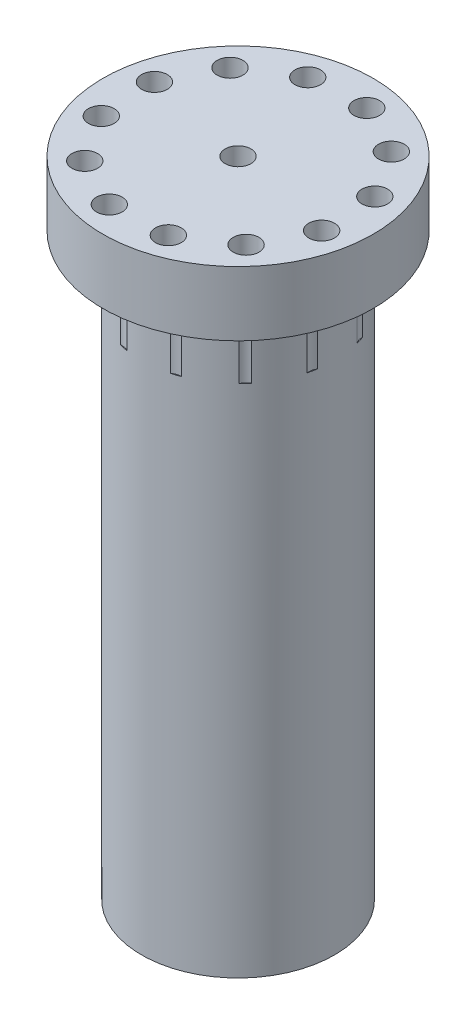
ISO-10303-21;
HEADER;
FILE_DESCRIPTION(('STEP AP214'),'2;1');
FILE_NAME('part.step','',(''),(''),'','','');
FILE_SCHEMA(('AUTOMOTIVE_DESIGN { 1 0 10303 214 1 1 1 1 }'));
ENDSEC;
DATA;
#1=APPLICATION_CONTEXT('core data for automotive mechanical design processes');
#2=APPLICATION_PROTOCOL_DEFINITION('international standard','automotive_design',2000,#1);
#3=PRODUCT_CONTEXT('',#1,'mechanical');
#4=PRODUCT('Part','Part','',(#3));
#5=PRODUCT_RELATED_PRODUCT_CATEGORY('part','',(#4));
#6=PRODUCT_DEFINITION_FORMATION('','',#4);
#7=PRODUCT_DEFINITION_CONTEXT('part definition',#1,'design');
#8=PRODUCT_DEFINITION('design','',#6,#7);
#9=PRODUCT_DEFINITION_SHAPE('','',#8);
#10=(LENGTH_UNIT() NAMED_UNIT(*) SI_UNIT(.MILLI.,.METRE.));
#11=(NAMED_UNIT(*) PLANE_ANGLE_UNIT() SI_UNIT($,.RADIAN.));
#12=(NAMED_UNIT(*) SI_UNIT($,.STERADIAN.) SOLID_ANGLE_UNIT());
#13=UNCERTAINTY_MEASURE_WITH_UNIT(LENGTH_MEASURE(1.E-05),#10,'distance_accuracy_value','');
#14=(GEOMETRIC_REPRESENTATION_CONTEXT(3) GLOBAL_UNCERTAINTY_ASSIGNED_CONTEXT((#13)) GLOBAL_UNIT_ASSIGNED_CONTEXT((#10,
#11,#12)) REPRESENTATION_CONTEXT('',''));
#15=CARTESIAN_POINT('',(0.,0.,0.));
#16=DIRECTION('',(0.,0.,1.));
#17=DIRECTION('',(1.,0.,0.));
#18=AXIS2_PLACEMENT_3D('',#15,#16,#17);
#19=CARTESIAN_POINT('',(0.,3.,0.));
#20=DIRECTION('',(0.,1.,0.));
#21=DIRECTION('',(0.,0.,1.));
#22=AXIS2_PLACEMENT_3D('',#19,#20,#21);
#23=PLANE('',#22);
#24=CARTESIAN_POINT('',(0.,3.,0.));
#25=DIRECTION('',(0.,1.,0.));
#26=DIRECTION('',(0.,0.,1.));
#27=AXIS2_PLACEMENT_3D('',#24,#25,#26);
#28=CIRCLE('',#27,3.);
#29=CARTESIAN_POINT('',(0.,3.,3.));
#30=VERTEX_POINT('',#29);
#31=EDGE_CURVE('E49',#30,#30,#28,.T.);
#32=ORIENTED_EDGE('',*,*,#31,.F.);
#33=EDGE_LOOP('',(#32));
#34=FACE_BOUND('',#33,.T.);
#35=CARTESIAN_POINT('',(0.,3.,0.));
#36=DIRECTION('',(0.,-1.,0.));
#37=DIRECTION('',(0.,0.,-1.));
#38=AXIS2_PLACEMENT_3D('',#35,#36,#37);
#39=CIRCLE('',#38,4.1);
#40=CARTESIAN_POINT('',(0.,3.,-4.1));
#41=VERTEX_POINT('',#40);
#42=EDGE_CURVE('E216',#41,#41,#39,.T.);
#43=ORIENTED_EDGE('',*,*,#42,.F.);
#44=EDGE_LOOP('',(#43));
#45=FACE_BOUND('',#44,.T.);
#46=ADVANCED_FACE('F45',(#34,#45),#23,.T.);
#47=CARTESIAN_POINT('',(0.,18.,0.));
#48=DIRECTION('',(0.,-1.,0.));
#49=DIRECTION('',(0.,0.,-1.));
#50=AXIS2_PLACEMENT_3D('',#47,#48,#49);
#51=CYLINDRICAL_SURFACE('',#50,4.1);
#52=ORIENTED_EDGE('',*,*,#42,.T.);
#53=EDGE_LOOP('',(#52));
#54=FACE_BOUND('',#53,.T.);
#55=CARTESIAN_POINT('',(0.,18.,0.));
#56=DIRECTION('',(0.,-1.,0.));
#57=DIRECTION('',(0.,0.,-1.));
#58=AXIS2_PLACEMENT_3D('',#55,#56,#57);
#59=CIRCLE('',#58,4.1);
#60=CARTESIAN_POINT('',(0.,18.,-4.1));
#61=VERTEX_POINT('',#60);
#62=EDGE_CURVE('E613',#61,#61,#59,.T.);
#63=ORIENTED_EDGE('',*,*,#62,.F.);
#64=EDGE_LOOP('',(#63));
#65=FACE_BOUND('',#64,.T.);
#66=ADVANCED_FACE('F622',(#54,#65),#51,.F.);
#67=CARTESIAN_POINT('',(4.1,18.,0.));
#68=DIRECTION('',(0.,-1.,0.));
#69=DIRECTION('',(0.,0.,-1.));
#70=AXIS2_PLACEMENT_3D('',#67,#68,#69);
#71=PLANE('',#70);
#72=CARTESIAN_POINT('',(0.,18.,0.));
#73=DIRECTION('',(0.,-1.,0.));
#74=DIRECTION('',(0.,0.,-1.));
#75=AXIS2_PLACEMENT_3D('',#72,#73,#74);
#76=CIRCLE('',#75,1.);
#77=CARTESIAN_POINT('',(0.,18.,-1.));
#78=VERTEX_POINT('',#77);
#79=EDGE_CURVE('E570',#78,#78,#76,.T.);
#80=ORIENTED_EDGE('',*,*,#79,.F.);
#81=EDGE_LOOP('',(#80));
#82=FACE_BOUND('',#81,.T.);
#83=ORIENTED_EDGE('',*,*,#62,.T.);
#84=EDGE_LOOP('',(#83));
#85=FACE_BOUND('',#84,.T.);
#86=ADVANCED_FACE('F630',(#82,#85),#71,.T.);
#87=CARTESIAN_POINT('',(0.,10.,0.));
#88=DIRECTION('',(0.,-1.,0.));
#89=DIRECTION('',(1.,0.,0.));
#90=AXIS2_PLACEMENT_3D('',#87,#88,#89);
#91=CYLINDRICAL_SURFACE('',#90,3.);
#92=ORIENTED_EDGE('',*,*,#31,.T.);
#93=EDGE_LOOP('',(#92));
#94=FACE_BOUND('',#93,.T.);
#95=CARTESIAN_POINT('',(0.,0.,0.));
#96=DIRECTION('',(0.,-1.,0.));
#97=DIRECTION('',(1.,0.,0.));
#98=AXIS2_PLACEMENT_3D('',#95,#96,#97);
#99=CIRCLE('',#98,3.);
#100=CARTESIAN_POINT('',(3.,0.,0.));
#101=VERTEX_POINT('',#100);
#102=EDGE_CURVE('E566',#101,#101,#99,.T.);
#103=ORIENTED_EDGE('',*,*,#102,.T.);
#104=EDGE_LOOP('',(#103));
#105=FACE_BOUND('',#104,.T.);
#106=ADVANCED_FACE('F635',(#94,#105),#91,.F.);
#107=CARTESIAN_POINT('',(7.5,0.,0.));
#108=DIRECTION('',(0.,-1.,0.));
#109=DIRECTION('',(0.,0.,-1.));
#110=AXIS2_PLACEMENT_3D('',#107,#108,#109);
#111=PLANE('',#110);
#112=ORIENTED_EDGE('',*,*,#102,.F.);
#113=EDGE_LOOP('',(#112));
#114=FACE_BOUND('',#113,.T.);
#115=CARTESIAN_POINT('',(0.,0.,0.));
#116=DIRECTION('',(0.,-1.,0.));
#117=DIRECTION('',(0.,0.,-1.));
#118=AXIS2_PLACEMENT_3D('',#115,#116,#117);
#119=CIRCLE('',#118,7.5);
#120=CARTESIAN_POINT('',(0.,0.,-7.5));
#121=VERTEX_POINT('',#120);
#122=EDGE_CURVE('E371',#121,#121,#119,.T.);
#123=ORIENTED_EDGE('',*,*,#122,.T.);
#124=EDGE_LOOP('',(#123));
#125=FACE_BOUND('',#124,.T.);
#126=ADVANCED_FACE('F47',(#114,#125),#111,.T.);
#127=CARTESIAN_POINT('',(7.5,50.,0.));
#128=DIRECTION('',(0.,1.,0.));
#129=DIRECTION('',(0.,0.,1.));
#130=AXIS2_PLACEMENT_3D('',#127,#128,#129);
#131=PLANE('',#130);
#132=CARTESIAN_POINT('',(0.,50.,0.));
#133=DIRECTION('',(0.,1.,0.));
#134=DIRECTION('',(0.,0.,1.));
#135=AXIS2_PLACEMENT_3D('',#132,#133,#134);
#136=CIRCLE('',#135,1.);
#137=CARTESIAN_POINT('',(0.,50.,1.));
#138=VERTEX_POINT('',#137);
#139=EDGE_CURVE('E574',#138,#138,#136,.T.);
#140=ORIENTED_EDGE('',*,*,#139,.F.);
#141=EDGE_LOOP('',(#140));
#142=FACE_BOUND('',#141,.T.);
#143=CARTESIAN_POINT('',(1.75395634255126,50.,-8.2500000000006));
#144=DIRECTION('',(0.,1.,0.));
#145=DIRECTION('',(-1.,0.,0.));
#146=AXIS2_PLACEMENT_3D('',#143,#144,#145);
#147=CIRCLE('',#146,1.);
#148=CARTESIAN_POINT('',(0.753956342551261,50.,-8.2500000000006));
#149=VERTEX_POINT('',#148);
#150=EDGE_CURVE('E539',#149,#149,#147,.T.);
#151=ORIENTED_EDGE('',*,*,#150,.F.);
#152=EDGE_LOOP('',(#151));
#153=FACE_BOUND('',#152,.T.);
#154=CARTESIAN_POINT('',(5.64397074977852,50.,-6.26773140994676));
#155=DIRECTION('',(0.,1.,0.));
#156=DIRECTION('',(-1.,0.,0.));
#157=AXIS2_PLACEMENT_3D('',#154,#155,#156);
#158=CIRCLE('',#157,1.);
#159=CARTESIAN_POINT('',(4.64397074977852,50.,-6.26773140994676));
#160=VERTEX_POINT('',#159);
#161=EDGE_CURVE('E489',#160,#160,#158,.T.);
#162=ORIENTED_EDGE('',*,*,#161,.F.);
#163=EDGE_LOOP('',(#162));
#164=FACE_BOUND('',#163,.T.);
#165=CARTESIAN_POINT('',(8.02168775249787,50.,-2.60602925022254));
#166=DIRECTION('',(0.,1.,0.));
#167=DIRECTION('',(-1.,0.,0.));
#168=AXIS2_PLACEMENT_3D('',#165,#166,#167);
#169=CIRCLE('',#168,1.);
#170=CARTESIAN_POINT('',(7.02168775249787,50.,-2.60602925022254));
#171=VERTEX_POINT('',#170);
#172=EDGE_CURVE('E490',#171,#171,#169,.T.);
#173=ORIENTED_EDGE('',*,*,#172,.F.);
#174=EDGE_LOOP('',(#173));
#175=FACE_BOUND('',#174,.T.);
#176=CARTESIAN_POINT('',(8.25000000000091,50.,1.75395634255066));
#177=DIRECTION('',(0.,1.,0.));
#178=DIRECTION('',(-1.,0.,0.));
#179=AXIS2_PLACEMENT_3D('',#176,#177,#178);
#180=CIRCLE('',#179,1.);
#181=CARTESIAN_POINT('',(7.25000000000091,50.,1.75395634255066));
#182=VERTEX_POINT('',#181);
#183=EDGE_CURVE('E503',#182,#182,#180,.T.);
#184=ORIENTED_EDGE('',*,*,#183,.F.);
#185=EDGE_LOOP('',(#184));
#186=FACE_BOUND('',#185,.T.);
#187=CARTESIAN_POINT('',(6.26773140994707,50.,5.64397074977792));
#188=DIRECTION('',(0.,1.,0.));
#189=DIRECTION('',(-1.,0.,0.));
#190=AXIS2_PLACEMENT_3D('',#187,#188,#189);
#191=CIRCLE('',#190,1.);
#192=CARTESIAN_POINT('',(5.26773140994707,50.,5.64397074977792));
#193=VERTEX_POINT('',#192);
#194=EDGE_CURVE('E510',#193,#193,#191,.T.);
#195=ORIENTED_EDGE('',*,*,#194,.F.);
#196=EDGE_LOOP('',(#195));
#197=FACE_BOUND('',#196,.T.);
#198=CARTESIAN_POINT('',(2.60602925022285,50.,8.02168775249727));
#199=DIRECTION('',(0.,1.,0.));
#200=DIRECTION('',(-1.,0.,0.));
#201=AXIS2_PLACEMENT_3D('',#198,#199,#200);
#202=CIRCLE('',#201,1.);
#203=CARTESIAN_POINT('',(1.60602925022285,50.,8.02168775249727));
#204=VERTEX_POINT('',#203);
#205=EDGE_CURVE('E517',#204,#204,#202,.T.);
#206=ORIENTED_EDGE('',*,*,#205,.F.);
#207=EDGE_LOOP('',(#206));
#208=FACE_BOUND('',#207,.T.);
#209=CARTESIAN_POINT('',(-1.75395634255035,50.,8.25000000000031));
#210=DIRECTION('',(0.,1.,0.));
#211=DIRECTION('',(-1.,0.,0.));
#212=AXIS2_PLACEMENT_3D('',#209,#210,#211);
#213=CIRCLE('',#212,1.);
#214=CARTESIAN_POINT('',(-2.75395634255035,50.,8.25000000000031));
#215=VERTEX_POINT('',#214);
#216=EDGE_CURVE('E524',#215,#215,#213,.T.);
#217=ORIENTED_EDGE('',*,*,#216,.F.);
#218=EDGE_LOOP('',(#217));
#219=FACE_BOUND('',#218,.T.);
#220=CARTESIAN_POINT('',(-5.64397074977761,50.,6.26773140994647));
#221=DIRECTION('',(0.,1.,0.));
#222=DIRECTION('',(-1.,0.,0.));
#223=AXIS2_PLACEMENT_3D('',#220,#221,#222);
#224=CIRCLE('',#223,1.);
#225=CARTESIAN_POINT('',(-6.64397074977761,50.,6.26773140994647));
#226=VERTEX_POINT('',#225);
#227=EDGE_CURVE('E531',#226,#226,#224,.T.);
#228=ORIENTED_EDGE('',*,*,#227,.F.);
#229=EDGE_LOOP('',(#228));
#230=FACE_BOUND('',#229,.T.);
#231=CARTESIAN_POINT('',(-8.02168775249696,50.,2.60602925022224));
#232=DIRECTION('',(0.,1.,0.));
#233=DIRECTION('',(-1.,0.,0.));
#234=AXIS2_PLACEMENT_3D('',#231,#232,#233);
#235=CIRCLE('',#234,1.);
#236=CARTESIAN_POINT('',(-9.02168775249696,50.,2.60602925022224));
#237=VERTEX_POINT('',#236);
#238=EDGE_CURVE('E560',#237,#237,#235,.T.);
#239=ORIENTED_EDGE('',*,*,#238,.F.);
#240=EDGE_LOOP('',(#239));
#241=FACE_BOUND('',#240,.T.);
#242=CARTESIAN_POINT('',(-8.25,50.,-1.75395634255095));
#243=DIRECTION('',(0.,1.,0.));
#244=DIRECTION('',(-1.,0.,0.));
#245=AXIS2_PLACEMENT_3D('',#242,#243,#244);
#246=CIRCLE('',#245,1.);
#247=CARTESIAN_POINT('',(-9.25,50.,-1.75395634255095));
#248=VERTEX_POINT('',#247);
#249=EDGE_CURVE('E553',#248,#248,#246,.T.);
#250=ORIENTED_EDGE('',*,*,#249,.F.);
#251=EDGE_LOOP('',(#250));
#252=FACE_BOUND('',#251,.T.);
#253=CARTESIAN_POINT('',(-6.26773140994616,50.,-5.64397074977821));
#254=DIRECTION('',(0.,1.,0.));
#255=DIRECTION('',(-1.,0.,0.));
#256=AXIS2_PLACEMENT_3D('',#253,#254,#255);
#257=CIRCLE('',#256,0.999999999999999);
#258=CARTESIAN_POINT('',(-7.26773140994616,50.,-5.64397074977821));
#259=VERTEX_POINT('',#258);
#260=EDGE_CURVE('E545',#259,#259,#257,.T.);
#261=ORIENTED_EDGE('',*,*,#260,.F.);
#262=EDGE_LOOP('',(#261));
#263=FACE_BOUND('',#262,.T.);
#264=CARTESIAN_POINT('',(-2.60602925022193,50.,-8.02168775249756));
#265=DIRECTION('',(0.,1.,0.));
#266=DIRECTION('',(-1.,0.,0.));
#267=AXIS2_PLACEMENT_3D('',#264,#265,#266);
#268=CIRCLE('',#267,1.);
#269=CARTESIAN_POINT('',(-3.60602925022193,50.,-8.02168775249756));
#270=VERTEX_POINT('',#269);
#271=EDGE_CURVE('E225',#270,#270,#268,.T.);
#272=ORIENTED_EDGE('',*,*,#271,.F.);
#273=EDGE_LOOP('',(#272));
#274=FACE_BOUND('',#273,.T.);
#275=CARTESIAN_POINT('',(0.,50.,0.));
#276=DIRECTION('',(0.,-1.,0.));
#277=DIRECTION('',(0.,0.,-1.));
#278=AXIS2_PLACEMENT_3D('',#275,#276,#277);
#279=CIRCLE('',#278,10.5);
#280=CARTESIAN_POINT('',(0.,50.,-10.5));
#281=VERTEX_POINT('',#280);
#282=EDGE_CURVE('E389',#281,#281,#279,.T.);
#283=ORIENTED_EDGE('',*,*,#282,.F.);
#284=EDGE_LOOP('',(#283));
#285=FACE_BOUND('',#284,.T.);
#286=ADVANCED_FACE('F581',(#142,#153,#164,#175,#186,#197,#208,#219,#230,#241,#252,#263,#274,
#285),#131,.T.);
#287=CARTESIAN_POINT('',(0.,18.,0.));
#288=DIRECTION('',(0.,-1.,0.));
#289=DIRECTION('',(0.,0.,-1.));
#290=AXIS2_PLACEMENT_3D('',#287,#288,#289);
#291=CYLINDRICAL_SURFACE('',#290,10.5);
#292=ORIENTED_EDGE('',*,*,#282,.T.);
#293=EDGE_LOOP('',(#292));
#294=FACE_BOUND('',#293,.T.);
#295=CARTESIAN_POINT('',(0.,45.,0.));
#296=DIRECTION('',(0.,-1.,0.));
#297=DIRECTION('',(0.,0.,-1.));
#298=AXIS2_PLACEMENT_3D('',#295,#296,#297);
#299=CIRCLE('',#298,10.5);
#300=CARTESIAN_POINT('',(0.,45.,-10.5));
#301=VERTEX_POINT('',#300);
#302=EDGE_CURVE('E383',#301,#301,#299,.T.);
#303=ORIENTED_EDGE('',*,*,#302,.F.);
#304=EDGE_LOOP('',(#303));
#305=FACE_BOUND('',#304,.T.);
#306=ADVANCED_FACE('F584',(#294,#305),#291,.T.);
#307=CARTESIAN_POINT('',(10.5,45.,0.));
#308=DIRECTION('',(0.,-1.,0.));
#309=DIRECTION('',(0.,0.,-1.));
#310=AXIS2_PLACEMENT_3D('',#307,#308,#309);
#311=PLANE('',#310);
#312=CARTESIAN_POINT('',(1.75395634255126,45.,-8.2500000000006));
#313=DIRECTION('',(0.,-1.,0.));
#314=DIRECTION('',(0.,0.,-1.));
#315=AXIS2_PLACEMENT_3D('',#312,#313,#314);
#316=CIRCLE('',#315,1.);
#317=CARTESIAN_POINT('',(1.22956005914832,45.,-7.3985256680603));
#318=VERTEX_POINT('',#317);
#319=CARTESIAN_POINT('',(1.88660653025674,45.,-7.25883708316922));
#320=VERTEX_POINT('',#319);
#321=EDGE_CURVE('E359',#318,#320,#316,.T.);
#322=ORIENTED_EDGE('',*,*,#321,.F.);
#323=CARTESIAN_POINT('',(0.,45.,0.));
#324=DIRECTION('',(0.,-1.,0.));
#325=DIRECTION('',(0.,0.,-1.));
#326=AXIS2_PLACEMENT_3D('',#323,#324,#325);
#327=CIRCLE('',#326,7.49999999999999);
#328=CARTESIAN_POINT('',(-1.99556935943602,45.,-7.22964058108562));
#329=VERTEX_POINT('',#328);
#330=EDGE_CURVE('E366',#329,#318,#327,.T.);
#331=ORIENTED_EDGE('',*,*,#330,.F.);
#332=CARTESIAN_POINT('',(-2.60602925022193,45.,-8.02168775249756));
#333=DIRECTION('',(0.,-1.,0.));
#334=DIRECTION('',(0.,0.,-1.));
#335=AXIS2_PLACEMENT_3D('',#332,#333,#334);
#336=CIRCLE('',#335,1.);
#337=CARTESIAN_POINT('',(-2.63443258732952,45.,-7.02209120866543));
#338=VERTEX_POINT('',#337);
#339=EDGE_CURVE('E224',#338,#329,#336,.T.);
#340=ORIENTED_EDGE('',*,*,#339,.F.);
#341=CARTESIAN_POINT('',(-5.34303405082789,45.,-5.26326772373339));
#342=VERTEX_POINT('',#341);
#343=EDGE_CURVE('E233',#342,#338,#327,.T.);
#344=ORIENTED_EDGE('',*,*,#343,.F.);
#345=CARTESIAN_POINT('',(-6.26773140994616,45.,-5.64397074977821));
#346=DIRECTION('',(0.,-1.,0.));
#347=DIRECTION('',(0.,0.,-1.));
#348=AXIS2_PLACEMENT_3D('',#345,#346,#347);
#349=CIRCLE('',#348,0.999999999999999);
#350=CARTESIAN_POINT('',(-5.79253114951807,45.,-4.76409308073036));
#351=VERTEX_POINT('',#350);
#352=EDGE_CURVE('E444',#351,#342,#349,.T.);
#353=ORIENTED_EDGE('',*,*,#352,.F.);
#354=CARTESIAN_POINT('',(-7.25883708316885,45.,-1.88660653025816));
#355=VERTEX_POINT('',#354);
#356=EDGE_CURVE('E378',#355,#351,#327,.T.);
#357=ORIENTED_EDGE('',*,*,#356,.F.);
#358=CARTESIAN_POINT('',(-8.25,45.,-1.75395634255095));
#359=DIRECTION('',(0.,-1.,0.));
#360=DIRECTION('',(0.,0.,-1.));
#361=AXIS2_PLACEMENT_3D('',#358,#359,#360);
#362=CIRCLE('',#361,1.);
#363=CARTESIAN_POINT('',(-7.3985256680606,45.,-1.22956005914653));
#364=VERTEX_POINT('',#363);
#365=EDGE_CURVE('E443',#364,#355,#362,.T.);
#366=ORIENTED_EDGE('',*,*,#365,.F.);
#367=CARTESIAN_POINT('',(-7.22964058108582,45.,1.9955693594353));
#368=VERTEX_POINT('',#367);
#369=EDGE_CURVE('E427',#368,#364,#327,.T.);
#370=ORIENTED_EDGE('',*,*,#369,.F.);
#371=CARTESIAN_POINT('',(-8.02168775249696,45.,2.60602925022224));
#372=DIRECTION('',(0.,-1.,0.));
#373=DIRECTION('',(0.,0.,-1.));
#374=AXIS2_PLACEMENT_3D('',#371,#372,#373);
#375=CIRCLE('',#374,1.);
#376=CARTESIAN_POINT('',(-7.02209120866485,45.,2.63443258733105));
#377=VERTEX_POINT('',#376);
#378=EDGE_CURVE('E450',#377,#368,#375,.T.);
#379=ORIENTED_EDGE('',*,*,#378,.F.);
#380=CARTESIAN_POINT('',(-5.2632677237333,45.,5.34303405082797));
#381=VERTEX_POINT('',#380);
#382=EDGE_CURVE('E421',#381,#377,#327,.T.);
#383=ORIENTED_EDGE('',*,*,#382,.F.);
#384=CARTESIAN_POINT('',(-5.64397074977761,45.,6.26773140994647));
#385=DIRECTION('',(0.,-1.,0.));
#386=DIRECTION('',(0.,0.,-1.));
#387=AXIS2_PLACEMENT_3D('',#384,#385,#386);
#388=CIRCLE('',#387,1.);
#389=CARTESIAN_POINT('',(-4.76409308072958,45.,5.7925311495187));
#390=VERTEX_POINT('',#389);
#391=EDGE_CURVE('E457',#390,#381,#388,.T.);
#392=ORIENTED_EDGE('',*,*,#391,.F.);
#393=CARTESIAN_POINT('',(-1.88660653025718,45.,7.2588370831691));
#394=VERTEX_POINT('',#393);
#395=EDGE_CURVE('E415',#394,#390,#327,.T.);
#396=ORIENTED_EDGE('',*,*,#395,.F.);
#397=CARTESIAN_POINT('',(-1.75395634255035,45.,8.25000000000031));
#398=DIRECTION('',(0.,-1.,0.));
#399=DIRECTION('',(0.,0.,-1.));
#400=AXIS2_PLACEMENT_3D('',#397,#398,#399);
#401=CIRCLE('',#400,1.);
#402=CARTESIAN_POINT('',(-1.2295600591464,45.,7.39852566806062));
#403=VERTEX_POINT('',#402);
#404=EDGE_CURVE('E460',#403,#394,#401,.T.);
#405=ORIENTED_EDGE('',*,*,#404,.F.);
#406=CARTESIAN_POINT('',(1.99556935943686,45.,7.22964058108539));
#407=VERTEX_POINT('',#406);
#408=EDGE_CURVE('E409',#407,#403,#327,.T.);
#409=ORIENTED_EDGE('',*,*,#408,.F.);
#410=CARTESIAN_POINT('',(2.60602925022285,45.,8.02168775249727));
#411=DIRECTION('',(0.,-1.,0.));
#412=DIRECTION('',(0.,0.,-1.));
#413=AXIS2_PLACEMENT_3D('',#410,#411,#412);
#414=CIRCLE('',#413,1.);
#415=CARTESIAN_POINT('',(2.63443258733031,45.,7.02209120866513));
#416=VERTEX_POINT('',#415);
#417=EDGE_CURVE('E463',#416,#407,#414,.T.);
#418=ORIENTED_EDGE('',*,*,#417,.F.);
#419=CARTESIAN_POINT('',(5.34303405082923,45.,5.26326772373203));
#420=VERTEX_POINT('',#419);
#421=EDGE_CURVE('E403',#420,#416,#327,.T.);
#422=ORIENTED_EDGE('',*,*,#421,.F.);
#423=CARTESIAN_POINT('',(6.26773140994707,45.,5.64397074977792));
#424=DIRECTION('',(0.,-1.,0.));
#425=DIRECTION('',(0.,0.,-1.));
#426=AXIS2_PLACEMENT_3D('',#423,#424,#425);
#427=CIRCLE('',#426,1.);
#428=CARTESIAN_POINT('',(5.79253114951777,45.,4.76409308073072));
#429=VERTEX_POINT('',#428);
#430=EDGE_CURVE('E466',#429,#420,#427,.T.);
#431=ORIENTED_EDGE('',*,*,#430,.F.);
#432=CARTESIAN_POINT('',(7.25883708316947,45.,1.88660653025576));
#433=VERTEX_POINT('',#432);
#434=EDGE_CURVE('E397',#433,#429,#327,.T.);
#435=ORIENTED_EDGE('',*,*,#434,.F.);
#436=CARTESIAN_POINT('',(8.25000000000091,45.,1.75395634255066));
#437=DIRECTION('',(0.,-1.,0.));
#438=DIRECTION('',(0.,0.,-1.));
#439=AXIS2_PLACEMENT_3D('',#436,#437,#438);
#440=CIRCLE('',#439,1.);
#441=CARTESIAN_POINT('',(7.39852566806033,45.,1.22956005914818));
#442=VERTEX_POINT('',#441);
#443=EDGE_CURVE('E469',#442,#433,#440,.T.);
#444=ORIENTED_EDGE('',*,*,#443,.F.);
#445=CARTESIAN_POINT('',(7.22964058108519,45.,-1.99556935943757));
#446=VERTEX_POINT('',#445);
#447=EDGE_CURVE('E391',#446,#442,#327,.T.);
#448=ORIENTED_EDGE('',*,*,#447,.F.);
#449=CARTESIAN_POINT('',(8.02168775249787,45.,-2.60602925022254));
#450=DIRECTION('',(0.,-1.,0.));
#451=DIRECTION('',(0.,0.,-1.));
#452=AXIS2_PLACEMENT_3D('',#449,#450,#451);
#453=CIRCLE('',#452,1.);
#454=CARTESIAN_POINT('',(7.0220912086657,45.,-2.63443258732879));
#455=VERTEX_POINT('',#454);
#456=EDGE_CURVE('E472',#455,#446,#453,.T.);
#457=ORIENTED_EDGE('',*,*,#456,.F.);
#458=CARTESIAN_POINT('',(5.26326772373213,45.,-5.34303405082913));
#459=VERTEX_POINT('',#458);
#460=EDGE_CURVE('E384',#459,#455,#327,.T.);
#461=ORIENTED_EDGE('',*,*,#460,.F.);
#462=CARTESIAN_POINT('',(5.64397074977852,45.,-6.26773140994676));
#463=DIRECTION('',(0.,-1.,0.));
#464=DIRECTION('',(0.,0.,-1.));
#465=AXIS2_PLACEMENT_3D('',#462,#463,#464);
#466=CIRCLE('',#465,1.);
#467=CARTESIAN_POINT('',(4.76409308073151,45.,-5.79253114951712));
#468=VERTEX_POINT('',#467);
#469=EDGE_CURVE('E372',#468,#459,#466,.T.);
#470=ORIENTED_EDGE('',*,*,#469,.F.);
#471=EDGE_CURVE('E369',#320,#468,#327,.T.);
#472=ORIENTED_EDGE('',*,*,#471,.F.);
#473=EDGE_LOOP('',(#322,#331,#340,#344,#353,#357,#366,#370,#379,#383,#392,#396,#405,#409,#418,
#422,#431,#435,#444,#448,#457,#461,#470,#472));
#474=FACE_BOUND('',#473,.T.);
#475=ORIENTED_EDGE('',*,*,#302,.T.);
#476=EDGE_LOOP('',(#475));
#477=FACE_BOUND('',#476,.T.);
#478=ADVANCED_FACE('F364',(#474,#477),#311,.T.);
#479=CARTESIAN_POINT('',(0.,18.,0.));
#480=DIRECTION('',(0.,-1.,0.));
#481=DIRECTION('',(0.,0.,-1.));
#482=AXIS2_PLACEMENT_3D('',#479,#480,#481);
#483=CYLINDRICAL_SURFACE('',#482,7.5);
#484=DIRECTION('',(0.,1.,0.));
#485=VECTOR('',#484,1.);
#486=CARTESIAN_POINT('',(1.88660653025674,45.,-7.25883708316922));
#487=LINE('',#486,#485);
#488=CARTESIAN_POINT('',(1.88660653025675,40.,-7.25883708316922));
#489=VERTEX_POINT('',#488);
#490=EDGE_CURVE('E11',#320,#489,#487,.F.);
#491=ORIENTED_EDGE('',*,*,#490,.F.);
#492=ORIENTED_EDGE('',*,*,#471,.T.);
#493=DIRECTION('',(0.,1.,0.));
#494=VECTOR('',#493,1.);
#495=CARTESIAN_POINT('',(4.76409308073151,45.,-5.79253114951712));
#496=LINE('',#495,#494);
#497=CARTESIAN_POINT('',(4.76409308073151,40.,-5.79253114951712));
#498=VERTEX_POINT('',#497);
#499=EDGE_CURVE('E343',#498,#468,#496,.T.);
#500=ORIENTED_EDGE('',*,*,#499,.F.);
#501=CARTESIAN_POINT('',(0.,40.,0.));
#502=DIRECTION('',(0.,1.,0.));
#503=DIRECTION('',(-1.,0.,0.));
#504=AXIS2_PLACEMENT_3D('',#501,#502,#503);
#505=CIRCLE('',#504,7.5);
#506=CARTESIAN_POINT('',(5.26326772373213,40.,-5.34303405082913));
#507=VERTEX_POINT('',#506);
#508=EDGE_CURVE('E339',#498,#507,#505,.F.);
#509=ORIENTED_EDGE('',*,*,#508,.T.);
#510=DIRECTION('',(0.,1.,0.));
#511=VECTOR('',#510,1.);
#512=CARTESIAN_POINT('',(5.26326772373213,45.,-5.34303405082913));
#513=LINE('',#512,#511);
#514=EDGE_CURVE('E346',#459,#507,#513,.F.);
#515=ORIENTED_EDGE('',*,*,#514,.F.);
#516=ORIENTED_EDGE('',*,*,#460,.T.);
#517=DIRECTION('',(0.,1.,0.));
#518=VECTOR('',#517,1.);
#519=CARTESIAN_POINT('',(7.0220912086657,45.,-2.63443258732879));
#520=LINE('',#519,#518);
#521=CARTESIAN_POINT('',(7.0220912086657,40.,-2.6344325873288));
#522=VERTEX_POINT('',#521);
#523=EDGE_CURVE('E332',#522,#455,#520,.T.);
#524=ORIENTED_EDGE('',*,*,#523,.F.);
#525=CARTESIAN_POINT('',(0.,40.,0.));
#526=DIRECTION('',(0.,1.,0.));
#527=DIRECTION('',(-1.,0.,0.));
#528=AXIS2_PLACEMENT_3D('',#525,#526,#527);
#529=CIRCLE('',#528,7.5);
#530=CARTESIAN_POINT('',(7.22964058108519,40.,-1.99556935943759));
#531=VERTEX_POINT('',#530);
#532=EDGE_CURVE('E328',#522,#531,#529,.F.);
#533=ORIENTED_EDGE('',*,*,#532,.T.);
#534=DIRECTION('',(0.,1.,0.));
#535=VECTOR('',#534,1.);
#536=CARTESIAN_POINT('',(7.22964058108519,45.,-1.99556935943759));
#537=LINE('',#536,#535);
#538=EDGE_CURVE('E335',#446,#531,#537,.F.);
#539=ORIENTED_EDGE('',*,*,#538,.F.);
#540=ORIENTED_EDGE('',*,*,#447,.T.);
#541=DIRECTION('',(0.,1.,0.));
#542=VECTOR('',#541,1.);
#543=CARTESIAN_POINT('',(7.39852566806032,45.,1.22956005914818));
#544=LINE('',#543,#542);
#545=CARTESIAN_POINT('',(7.39852566806033,40.,1.22956005914817));
#546=VERTEX_POINT('',#545);
#547=EDGE_CURVE('E321',#546,#442,#544,.T.);
#548=ORIENTED_EDGE('',*,*,#547,.F.);
#549=CARTESIAN_POINT('',(0.,40.,0.));
#550=DIRECTION('',(0.,1.,0.));
#551=DIRECTION('',(-1.,0.,0.));
#552=AXIS2_PLACEMENT_3D('',#549,#550,#551);
#553=CIRCLE('',#552,7.5);
#554=CARTESIAN_POINT('',(7.25883708316947,40.,1.88660653025575));
#555=VERTEX_POINT('',#554);
#556=EDGE_CURVE('E317',#546,#555,#553,.F.);
#557=ORIENTED_EDGE('',*,*,#556,.T.);
#558=DIRECTION('',(0.,1.,0.));
#559=VECTOR('',#558,1.);
#560=CARTESIAN_POINT('',(7.25883708316947,45.,1.88660653025575));
#561=LINE('',#560,#559);
#562=EDGE_CURVE('E324',#433,#555,#561,.F.);
#563=ORIENTED_EDGE('',*,*,#562,.F.);
#564=ORIENTED_EDGE('',*,*,#434,.T.);
#565=DIRECTION('',(0.,1.,0.));
#566=VECTOR('',#565,1.);
#567=CARTESIAN_POINT('',(5.79253114951777,45.,4.76409308073072));
#568=LINE('',#567,#566);
#569=CARTESIAN_POINT('',(5.79253114951776,40.,4.76409308073072));
#570=VERTEX_POINT('',#569);
#571=EDGE_CURVE('E310',#570,#429,#568,.T.);
#572=ORIENTED_EDGE('',*,*,#571,.F.);
#573=CARTESIAN_POINT('',(0.,40.,0.));
#574=DIRECTION('',(0.,1.,0.));
#575=DIRECTION('',(-1.,0.,0.));
#576=AXIS2_PLACEMENT_3D('',#573,#574,#575);
#577=CIRCLE('',#576,7.5);
#578=CARTESIAN_POINT('',(5.34303405082923,40.,5.26326772373203));
#579=VERTEX_POINT('',#578);
#580=EDGE_CURVE('E306',#570,#579,#577,.F.);
#581=ORIENTED_EDGE('',*,*,#580,.T.);
#582=DIRECTION('',(0.,1.,0.));
#583=VECTOR('',#582,1.);
#584=CARTESIAN_POINT('',(5.34303405082923,45.,5.26326772373204));
#585=LINE('',#584,#583);
#586=EDGE_CURVE('E313',#420,#579,#585,.F.);
#587=ORIENTED_EDGE('',*,*,#586,.F.);
#588=ORIENTED_EDGE('',*,*,#421,.T.);
#589=DIRECTION('',(0.,1.,0.));
#590=VECTOR('',#589,1.);
#591=CARTESIAN_POINT('',(2.63443258733032,45.,7.02209120866513));
#592=LINE('',#591,#590);
#593=CARTESIAN_POINT('',(2.63443258733031,40.,7.02209120866513));
#594=VERTEX_POINT('',#593);
#595=EDGE_CURVE('E299',#594,#416,#592,.T.);
#596=ORIENTED_EDGE('',*,*,#595,.F.);
#597=CARTESIAN_POINT('',(0.,40.,0.));
#598=DIRECTION('',(0.,1.,0.));
#599=DIRECTION('',(-1.,0.,0.));
#600=AXIS2_PLACEMENT_3D('',#597,#598,#599);
#601=CIRCLE('',#600,7.5);
#602=CARTESIAN_POINT('',(1.99556935943685,40.,7.2296405810854));
#603=VERTEX_POINT('',#602);
#604=EDGE_CURVE('E295',#594,#603,#601,.F.);
#605=ORIENTED_EDGE('',*,*,#604,.T.);
#606=DIRECTION('',(0.,1.,0.));
#607=VECTOR('',#606,1.);
#608=CARTESIAN_POINT('',(1.99556935943685,45.,7.2296405810854));
#609=LINE('',#608,#607);
#610=EDGE_CURVE('E302',#407,#603,#609,.F.);
#611=ORIENTED_EDGE('',*,*,#610,.F.);
#612=ORIENTED_EDGE('',*,*,#408,.T.);
#613=DIRECTION('',(0.,1.,0.));
#614=VECTOR('',#613,1.);
#615=CARTESIAN_POINT('',(-1.2295600591464,45.,7.39852566806063));
#616=LINE('',#615,#614);
#617=CARTESIAN_POINT('',(-1.22956005914641,40.,7.39852566806062));
#618=VERTEX_POINT('',#617);
#619=EDGE_CURVE('E288',#618,#403,#616,.T.);
#620=ORIENTED_EDGE('',*,*,#619,.F.);
#621=CARTESIAN_POINT('',(0.,40.,0.));
#622=DIRECTION('',(0.,1.,0.));
#623=DIRECTION('',(-1.,0.,0.));
#624=AXIS2_PLACEMENT_3D('',#621,#622,#623);
#625=CIRCLE('',#624,7.5);
#626=CARTESIAN_POINT('',(-1.88660653025717,40.,7.2588370831691));
#627=VERTEX_POINT('',#626);
#628=EDGE_CURVE('E284',#618,#627,#625,.F.);
#629=ORIENTED_EDGE('',*,*,#628,.T.);
#630=DIRECTION('',(0.,1.,0.));
#631=VECTOR('',#630,1.);
#632=CARTESIAN_POINT('',(-1.88660653025719,45.,7.25883708316911));
#633=LINE('',#632,#631);
#634=EDGE_CURVE('E291',#394,#627,#633,.F.);
#635=ORIENTED_EDGE('',*,*,#634,.F.);
#636=ORIENTED_EDGE('',*,*,#395,.T.);
#637=DIRECTION('',(0.,1.,0.));
#638=VECTOR('',#637,1.);
#639=CARTESIAN_POINT('',(-4.76409308072958,45.,5.79253114951871));
#640=LINE('',#639,#638);
#641=CARTESIAN_POINT('',(-4.76409308072958,40.,5.7925311495187));
#642=VERTEX_POINT('',#641);
#643=EDGE_CURVE('E277',#642,#390,#640,.T.);
#644=ORIENTED_EDGE('',*,*,#643,.F.);
#645=CARTESIAN_POINT('',(0.,40.,0.));
#646=DIRECTION('',(0.,1.,0.));
#647=DIRECTION('',(-1.,0.,0.));
#648=AXIS2_PLACEMENT_3D('',#645,#646,#647);
#649=CIRCLE('',#648,7.5);
#650=CARTESIAN_POINT('',(-5.2632677237333,40.,5.34303405082798));
#651=VERTEX_POINT('',#650);
#652=EDGE_CURVE('E273',#642,#651,#649,.F.);
#653=ORIENTED_EDGE('',*,*,#652,.T.);
#654=DIRECTION('',(0.,1.,0.));
#655=VECTOR('',#654,1.);
#656=CARTESIAN_POINT('',(-5.2632677237333,45.,5.34303405082798));
#657=LINE('',#656,#655);
#658=EDGE_CURVE('E280',#381,#651,#657,.F.);
#659=ORIENTED_EDGE('',*,*,#658,.F.);
#660=ORIENTED_EDGE('',*,*,#382,.T.);
#661=DIRECTION('',(0.,1.,0.));
#662=VECTOR('',#661,1.);
#663=CARTESIAN_POINT('',(-7.02209120866486,45.,2.63443258733104));
#664=LINE('',#663,#662);
#665=CARTESIAN_POINT('',(-7.02209120866486,40.,2.63443258733103));
#666=VERTEX_POINT('',#665);
#667=EDGE_CURVE('E266',#666,#377,#664,.T.);
#668=ORIENTED_EDGE('',*,*,#667,.F.);
#669=CARTESIAN_POINT('',(0.,40.,0.));
#670=DIRECTION('',(0.,1.,0.));
#671=DIRECTION('',(-1.,0.,0.));
#672=AXIS2_PLACEMENT_3D('',#669,#670,#671);
#673=CIRCLE('',#672,7.5);
#674=CARTESIAN_POINT('',(-7.22964058108583,40.,1.99556935943529));
#675=VERTEX_POINT('',#674);
#676=EDGE_CURVE('E262',#666,#675,#673,.F.);
#677=ORIENTED_EDGE('',*,*,#676,.T.);
#678=DIRECTION('',(0.,1.,0.));
#679=VECTOR('',#678,1.);
#680=CARTESIAN_POINT('',(-7.22964058108583,45.,1.99556935943528));
#681=LINE('',#680,#679);
#682=EDGE_CURVE('E269',#368,#675,#681,.F.);
#683=ORIENTED_EDGE('',*,*,#682,.F.);
#684=ORIENTED_EDGE('',*,*,#369,.T.);
#685=DIRECTION('',(0.,1.,0.));
#686=VECTOR('',#685,1.);
#687=CARTESIAN_POINT('',(-7.3985256680606,45.,-1.22956005914653));
#688=LINE('',#687,#686);
#689=CARTESIAN_POINT('',(-7.3985256680606,40.,-1.22956005914655));
#690=VERTEX_POINT('',#689);
#691=EDGE_CURVE('E255',#690,#364,#688,.T.);
#692=ORIENTED_EDGE('',*,*,#691,.F.);
#693=CARTESIAN_POINT('',(0.,40.,0.));
#694=DIRECTION('',(0.,1.,0.));
#695=DIRECTION('',(-1.,0.,0.));
#696=AXIS2_PLACEMENT_3D('',#693,#694,#695);
#697=CIRCLE('',#696,7.5);
#698=CARTESIAN_POINT('',(-7.25883708316885,40.,-1.88660653025816));
#699=VERTEX_POINT('',#698);
#700=EDGE_CURVE('E251',#690,#699,#697,.F.);
#701=ORIENTED_EDGE('',*,*,#700,.T.);
#702=DIRECTION('',(0.,1.,0.));
#703=VECTOR('',#702,1.);
#704=CARTESIAN_POINT('',(-7.25883708316885,45.,-1.88660653025818));
#705=LINE('',#704,#703);
#706=EDGE_CURVE('E258',#355,#699,#705,.F.);
#707=ORIENTED_EDGE('',*,*,#706,.F.);
#708=ORIENTED_EDGE('',*,*,#356,.T.);
#709=DIRECTION('',(0.,1.,0.));
#710=VECTOR('',#709,1.);
#711=CARTESIAN_POINT('',(-5.79253114951807,45.,-4.76409308073036));
#712=LINE('',#711,#710);
#713=CARTESIAN_POINT('',(-5.79253114951806,40.,-4.76409308073037));
#714=VERTEX_POINT('',#713);
#715=EDGE_CURVE('E244',#714,#351,#712,.T.);
#716=ORIENTED_EDGE('',*,*,#715,.F.);
#717=CARTESIAN_POINT('',(0.,40.,0.));
#718=DIRECTION('',(0.,1.,0.));
#719=DIRECTION('',(-1.,0.,0.));
#720=AXIS2_PLACEMENT_3D('',#717,#718,#719);
#721=CIRCLE('',#720,7.5);
#722=CARTESIAN_POINT('',(-5.34303405082788,40.,-5.2632677237334));
#723=VERTEX_POINT('',#722);
#724=EDGE_CURVE('E237',#714,#723,#721,.F.);
#725=ORIENTED_EDGE('',*,*,#724,.T.);
#726=DIRECTION('',(0.,1.,0.));
#727=VECTOR('',#726,1.);
#728=CARTESIAN_POINT('',(-5.34303405082787,45.,-5.26326772373342));
#729=LINE('',#728,#727);
#730=EDGE_CURVE('E247',#342,#723,#729,.F.);
#731=ORIENTED_EDGE('',*,*,#730,.F.);
#732=ORIENTED_EDGE('',*,*,#343,.T.);
#733=DIRECTION('',(0.,1.,0.));
#734=VECTOR('',#733,1.);
#735=CARTESIAN_POINT('',(-2.63443258732952,45.,-7.02209120866543));
#736=LINE('',#735,#734);
#737=CARTESIAN_POINT('',(-2.63443258732952,40.,-7.02209120866543));
#738=VERTEX_POINT('',#737);
#739=EDGE_CURVE('E215',#738,#338,#736,.T.);
#740=ORIENTED_EDGE('',*,*,#739,.F.);
#741=CARTESIAN_POINT('',(0.,40.,0.));
#742=DIRECTION('',(0.,1.,0.));
#743=DIRECTION('',(-1.,0.,0.));
#744=AXIS2_PLACEMENT_3D('',#741,#742,#743);
#745=CIRCLE('',#744,7.5);
#746=CARTESIAN_POINT('',(-1.99556935943603,40.,-7.22964058108562));
#747=VERTEX_POINT('',#746);
#748=EDGE_CURVE('E206',#738,#747,#745,.F.);
#749=ORIENTED_EDGE('',*,*,#748,.T.);
#750=DIRECTION('',(0.,1.,0.));
#751=VECTOR('',#750,1.);
#752=CARTESIAN_POINT('',(-1.99556935943602,45.,-7.22964058108562));
#753=LINE('',#752,#751);
#754=EDGE_CURVE('E222',#329,#747,#753,.F.);
#755=ORIENTED_EDGE('',*,*,#754,.F.);
#756=ORIENTED_EDGE('',*,*,#330,.T.);
#757=DIRECTION('',(0.,1.,0.));
#758=VECTOR('',#757,1.);
#759=CARTESIAN_POINT('',(1.22956005914832,45.,-7.3985256680603));
#760=LINE('',#759,#758);
#761=CARTESIAN_POINT('',(1.22956005914832,40.,-7.3985256680603));
#762=VERTEX_POINT('',#761);
#763=EDGE_CURVE('E55',#762,#318,#760,.T.);
#764=ORIENTED_EDGE('',*,*,#763,.F.);
#765=CARTESIAN_POINT('',(0.,40.,0.));
#766=DIRECTION('',(0.,1.,0.));
#767=DIRECTION('',(-1.,0.,0.));
#768=AXIS2_PLACEMENT_3D('',#765,#766,#767);
#769=CIRCLE('',#768,7.5);
#770=EDGE_CURVE('E349',#762,#489,#769,.F.);
#771=ORIENTED_EDGE('',*,*,#770,.T.);
#772=EDGE_LOOP('',(#491,#492,#500,#509,#515,#516,#524,#533,#539,#540,#548,#557,#563,#564,#572,
#581,#587,#588,#596,#605,#611,#612,#620,#629,#635,#636,#644,#653,#659,#660,#668,#677,#683,#684,
#692,#701,#707,#708,#716,#725,#731,#732,#740,#749,#755,#756,#764,#771));
#773=FACE_BOUND('',#772,.T.);
#774=ORIENTED_EDGE('',*,*,#122,.F.);
#775=EDGE_LOOP('',(#774));
#776=FACE_BOUND('',#775,.T.);
#777=ADVANCED_FACE('F229',(#773,#776),#483,.T.);
#778=CARTESIAN_POINT('',(-2.60602925022193,40.,-8.02168775249756));
#779=DIRECTION('',(0.,1.,0.));
#780=DIRECTION('',(-1.,0.,0.));
#781=AXIS2_PLACEMENT_3D('',#778,#779,#780);
#782=CYLINDRICAL_SURFACE('',#781,1.);
#783=ORIENTED_EDGE('',*,*,#754,.T.);
#784=CARTESIAN_POINT('',(-2.60602925022193,40.,-8.02168775249756));
#785=DIRECTION('',(0.,1.,0.));
#786=DIRECTION('',(-1.,0.,0.));
#787=AXIS2_PLACEMENT_3D('',#784,#785,#786);
#788=CIRCLE('',#787,1.);
#789=EDGE_CURVE('E209',#738,#747,#788,.T.);
#790=ORIENTED_EDGE('',*,*,#789,.F.);
#791=ORIENTED_EDGE('',*,*,#739,.T.);
#792=ORIENTED_EDGE('',*,*,#339,.T.);
#793=EDGE_LOOP('',(#783,#790,#791,#792));
#794=FACE_BOUND('',#793,.T.);
#795=ORIENTED_EDGE('',*,*,#271,.T.);
#796=EDGE_LOOP('',(#795));
#797=FACE_BOUND('',#796,.T.);
#798=ADVANCED_FACE('F219',(#794,#797),#782,.F.);
#799=CARTESIAN_POINT('',(-2.60602925022193,40.,-8.02168775249756));
#800=DIRECTION('',(0.,1.,0.));
#801=DIRECTION('',(-1.,0.,0.));
#802=AXIS2_PLACEMENT_3D('',#799,#800,#801);
#803=PLANE('',#802);
#804=ORIENTED_EDGE('',*,*,#789,.T.);
#805=ORIENTED_EDGE('',*,*,#748,.F.);
#806=EDGE_LOOP('',(#804,#805));
#807=FACE_BOUND('',#806,.T.);
#808=ADVANCED_FACE('F208',(#807),#803,.T.);
#809=CARTESIAN_POINT('',(-6.26773140994616,40.,-5.64397074977821));
#810=DIRECTION('',(0.,1.,0.));
#811=DIRECTION('',(-1.,0.,0.));
#812=AXIS2_PLACEMENT_3D('',#809,#810,#811);
#813=CYLINDRICAL_SURFACE('',#812,0.999999999999999);
#814=ORIENTED_EDGE('',*,*,#730,.T.);
#815=CARTESIAN_POINT('',(-6.26773140994616,40.,-5.64397074977821));
#816=DIRECTION('',(0.,1.,0.));
#817=DIRECTION('',(-1.,0.,0.));
#818=AXIS2_PLACEMENT_3D('',#815,#816,#817);
#819=CIRCLE('',#818,0.999999999999999);
#820=EDGE_CURVE('E550',#714,#723,#819,.T.);
#821=ORIENTED_EDGE('',*,*,#820,.F.);
#822=ORIENTED_EDGE('',*,*,#715,.T.);
#823=ORIENTED_EDGE('',*,*,#352,.T.);
#824=EDGE_LOOP('',(#814,#821,#822,#823));
#825=FACE_BOUND('',#824,.T.);
#826=ORIENTED_EDGE('',*,*,#260,.T.);
#827=EDGE_LOOP('',(#826));
#828=FACE_BOUND('',#827,.T.);
#829=ADVANCED_FACE('F648',(#825,#828),#813,.F.);
#830=CARTESIAN_POINT('',(-6.26773140994616,40.,-5.64397074977821));
#831=DIRECTION('',(0.,1.,0.));
#832=DIRECTION('',(-1.,0.,0.));
#833=AXIS2_PLACEMENT_3D('',#830,#831,#832);
#834=PLANE('',#833);
#835=ORIENTED_EDGE('',*,*,#820,.T.);
#836=ORIENTED_EDGE('',*,*,#724,.F.);
#837=EDGE_LOOP('',(#835,#836));
#838=FACE_BOUND('',#837,.T.);
#839=ADVANCED_FACE('F706',(#838),#834,.T.);
#840=CARTESIAN_POINT('',(-8.25,40.,-1.75395634255095));
#841=DIRECTION('',(0.,1.,0.));
#842=DIRECTION('',(-1.,0.,0.));
#843=AXIS2_PLACEMENT_3D('',#840,#841,#842);
#844=CYLINDRICAL_SURFACE('',#843,1.);
#845=ORIENTED_EDGE('',*,*,#706,.T.);
#846=CARTESIAN_POINT('',(-8.25,40.,-1.75395634255095));
#847=DIRECTION('',(0.,1.,0.));
#848=DIRECTION('',(-1.,0.,0.));
#849=AXIS2_PLACEMENT_3D('',#846,#847,#848);
#850=CIRCLE('',#849,1.);
#851=EDGE_CURVE('E557',#690,#699,#850,.T.);
#852=ORIENTED_EDGE('',*,*,#851,.F.);
#853=ORIENTED_EDGE('',*,*,#691,.T.);
#854=ORIENTED_EDGE('',*,*,#365,.T.);
#855=EDGE_LOOP('',(#845,#852,#853,#854));
#856=FACE_BOUND('',#855,.T.);
#857=ORIENTED_EDGE('',*,*,#249,.T.);
#858=EDGE_LOOP('',(#857));
#859=FACE_BOUND('',#858,.T.);
#860=ADVANCED_FACE('F709',(#856,#859),#844,.F.);
#861=CARTESIAN_POINT('',(-8.25,40.,-1.75395634255095));
#862=DIRECTION('',(0.,1.,0.));
#863=DIRECTION('',(-1.,0.,0.));
#864=AXIS2_PLACEMENT_3D('',#861,#862,#863);
#865=PLANE('',#864);
#866=ORIENTED_EDGE('',*,*,#851,.T.);
#867=ORIENTED_EDGE('',*,*,#700,.F.);
#868=EDGE_LOOP('',(#866,#867));
#869=FACE_BOUND('',#868,.T.);
#870=ADVANCED_FACE('F713',(#869),#865,.T.);
#871=CARTESIAN_POINT('',(-8.02168775249696,40.,2.60602925022224));
#872=DIRECTION('',(0.,1.,0.));
#873=DIRECTION('',(-1.,0.,0.));
#874=AXIS2_PLACEMENT_3D('',#871,#872,#873);
#875=CYLINDRICAL_SURFACE('',#874,1.);
#876=ORIENTED_EDGE('',*,*,#682,.T.);
#877=CARTESIAN_POINT('',(-8.02168775249696,40.,2.60602925022224));
#878=DIRECTION('',(0.,1.,0.));
#879=DIRECTION('',(-1.,0.,0.));
#880=AXIS2_PLACEMENT_3D('',#877,#878,#879);
#881=CIRCLE('',#880,1.);
#882=EDGE_CURVE('E534',#666,#675,#881,.T.);
#883=ORIENTED_EDGE('',*,*,#882,.F.);
#884=ORIENTED_EDGE('',*,*,#667,.T.);
#885=ORIENTED_EDGE('',*,*,#378,.T.);
#886=EDGE_LOOP('',(#876,#883,#884,#885));
#887=FACE_BOUND('',#886,.T.);
#888=ORIENTED_EDGE('',*,*,#238,.T.);
#889=EDGE_LOOP('',(#888));
#890=FACE_BOUND('',#889,.T.);
#891=ADVANCED_FACE('F717',(#887,#890),#875,.F.);
#892=CARTESIAN_POINT('',(-8.02168775249696,40.,2.60602925022224));
#893=DIRECTION('',(0.,1.,0.));
#894=DIRECTION('',(-1.,0.,0.));
#895=AXIS2_PLACEMENT_3D('',#892,#893,#894);
#896=PLANE('',#895);
#897=ORIENTED_EDGE('',*,*,#882,.T.);
#898=ORIENTED_EDGE('',*,*,#676,.F.);
#899=EDGE_LOOP('',(#897,#898));
#900=FACE_BOUND('',#899,.T.);
#901=ADVANCED_FACE('F653',(#900),#896,.T.);
#902=CARTESIAN_POINT('',(-5.64397074977761,40.,6.26773140994647));
#903=DIRECTION('',(0.,1.,0.));
#904=DIRECTION('',(-1.,0.,0.));
#905=AXIS2_PLACEMENT_3D('',#902,#903,#904);
#906=CYLINDRICAL_SURFACE('',#905,1.);
#907=ORIENTED_EDGE('',*,*,#658,.T.);
#908=CARTESIAN_POINT('',(-5.64397074977761,40.,6.26773140994647));
#909=DIRECTION('',(0.,1.,0.));
#910=DIRECTION('',(-1.,0.,0.));
#911=AXIS2_PLACEMENT_3D('',#908,#909,#910);
#912=CIRCLE('',#911,1.);
#913=EDGE_CURVE('E528',#642,#651,#912,.T.);
#914=ORIENTED_EDGE('',*,*,#913,.F.);
#915=ORIENTED_EDGE('',*,*,#643,.T.);
#916=ORIENTED_EDGE('',*,*,#391,.T.);
#917=EDGE_LOOP('',(#907,#914,#915,#916));
#918=FACE_BOUND('',#917,.T.);
#919=ORIENTED_EDGE('',*,*,#227,.T.);
#920=EDGE_LOOP('',(#919));
#921=FACE_BOUND('',#920,.T.);
#922=ADVANCED_FACE('F649',(#918,#921),#906,.F.);
#923=CARTESIAN_POINT('',(-5.64397074977761,40.,6.26773140994647));
#924=DIRECTION('',(0.,1.,0.));
#925=DIRECTION('',(-1.,0.,0.));
#926=AXIS2_PLACEMENT_3D('',#923,#924,#925);
#927=PLANE('',#926);
#928=ORIENTED_EDGE('',*,*,#913,.T.);
#929=ORIENTED_EDGE('',*,*,#652,.F.);
#930=EDGE_LOOP('',(#928,#929));
#931=FACE_BOUND('',#930,.T.);
#932=ADVANCED_FACE('F652',(#931),#927,.T.);
#933=CARTESIAN_POINT('',(-1.75395634255035,40.,8.25000000000031));
#934=DIRECTION('',(0.,1.,0.));
#935=DIRECTION('',(-1.,0.,0.));
#936=AXIS2_PLACEMENT_3D('',#933,#934,#935);
#937=CYLINDRICAL_SURFACE('',#936,1.);
#938=ORIENTED_EDGE('',*,*,#634,.T.);
#939=CARTESIAN_POINT('',(-1.75395634255035,40.,8.25000000000031));
#940=DIRECTION('',(0.,1.,0.));
#941=DIRECTION('',(-1.,0.,0.));
#942=AXIS2_PLACEMENT_3D('',#939,#940,#941);
#943=CIRCLE('',#942,1.);
#944=EDGE_CURVE('E521',#618,#627,#943,.T.);
#945=ORIENTED_EDGE('',*,*,#944,.F.);
#946=ORIENTED_EDGE('',*,*,#619,.T.);
#947=ORIENTED_EDGE('',*,*,#404,.T.);
#948=EDGE_LOOP('',(#938,#945,#946,#947));
#949=FACE_BOUND('',#948,.T.);
#950=ORIENTED_EDGE('',*,*,#216,.T.);
#951=EDGE_LOOP('',(#950));
#952=FACE_BOUND('',#951,.T.);
#953=ADVANCED_FACE('F657',(#949,#952),#937,.F.);
#954=CARTESIAN_POINT('',(-1.75395634255035,40.,8.25000000000031));
#955=DIRECTION('',(0.,1.,0.));
#956=DIRECTION('',(-1.,0.,0.));
#957=AXIS2_PLACEMENT_3D('',#954,#955,#956);
#958=PLANE('',#957);
#959=ORIENTED_EDGE('',*,*,#944,.T.);
#960=ORIENTED_EDGE('',*,*,#628,.F.);
#961=EDGE_LOOP('',(#959,#960));
#962=FACE_BOUND('',#961,.T.);
#963=ADVANCED_FACE('F661',(#962),#958,.T.);
#964=CARTESIAN_POINT('',(2.60602925022285,40.,8.02168775249727));
#965=DIRECTION('',(0.,1.,0.));
#966=DIRECTION('',(-1.,0.,0.));
#967=AXIS2_PLACEMENT_3D('',#964,#965,#966);
#968=CYLINDRICAL_SURFACE('',#967,1.);
#969=ORIENTED_EDGE('',*,*,#610,.T.);
#970=CARTESIAN_POINT('',(2.60602925022285,40.,8.02168775249727));
#971=DIRECTION('',(0.,1.,0.));
#972=DIRECTION('',(-1.,0.,0.));
#973=AXIS2_PLACEMENT_3D('',#970,#971,#972);
#974=CIRCLE('',#973,1.);
#975=EDGE_CURVE('E514',#594,#603,#974,.T.);
#976=ORIENTED_EDGE('',*,*,#975,.F.);
#977=ORIENTED_EDGE('',*,*,#595,.T.);
#978=ORIENTED_EDGE('',*,*,#417,.T.);
#979=EDGE_LOOP('',(#969,#976,#977,#978));
#980=FACE_BOUND('',#979,.T.);
#981=ORIENTED_EDGE('',*,*,#205,.T.);
#982=EDGE_LOOP('',(#981));
#983=FACE_BOUND('',#982,.T.);
#984=ADVANCED_FACE('F665',(#980,#983),#968,.F.);
#985=CARTESIAN_POINT('',(2.60602925022285,40.,8.02168775249727));
#986=DIRECTION('',(0.,1.,0.));
#987=DIRECTION('',(-1.,0.,0.));
#988=AXIS2_PLACEMENT_3D('',#985,#986,#987);
#989=PLANE('',#988);
#990=ORIENTED_EDGE('',*,*,#975,.T.);
#991=ORIENTED_EDGE('',*,*,#604,.F.);
#992=EDGE_LOOP('',(#990,#991));
#993=FACE_BOUND('',#992,.T.);
#994=ADVANCED_FACE('F669',(#993),#989,.T.);
#995=CARTESIAN_POINT('',(6.26773140994707,40.,5.64397074977792));
#996=DIRECTION('',(0.,1.,0.));
#997=DIRECTION('',(-1.,0.,0.));
#998=AXIS2_PLACEMENT_3D('',#995,#996,#997);
#999=CYLINDRICAL_SURFACE('',#998,1.);
#1000=ORIENTED_EDGE('',*,*,#586,.T.);
#1001=CARTESIAN_POINT('',(6.26773140994707,40.,5.64397074977792));
#1002=DIRECTION('',(0.,1.,0.));
#1003=DIRECTION('',(-1.,0.,0.));
#1004=AXIS2_PLACEMENT_3D('',#1001,#1002,#1003);
#1005=CIRCLE('',#1004,1.);
#1006=EDGE_CURVE('E507',#570,#579,#1005,.T.);
#1007=ORIENTED_EDGE('',*,*,#1006,.F.);
#1008=ORIENTED_EDGE('',*,*,#571,.T.);
#1009=ORIENTED_EDGE('',*,*,#430,.T.);
#1010=EDGE_LOOP('',(#1000,#1007,#1008,#1009));
#1011=FACE_BOUND('',#1010,.T.);
#1012=ORIENTED_EDGE('',*,*,#194,.T.);
#1013=EDGE_LOOP('',(#1012));
#1014=FACE_BOUND('',#1013,.T.);
#1015=ADVANCED_FACE('F673',(#1011,#1014),#999,.F.);
#1016=CARTESIAN_POINT('',(6.26773140994707,40.,5.64397074977792));
#1017=DIRECTION('',(0.,1.,0.));
#1018=DIRECTION('',(-1.,0.,0.));
#1019=AXIS2_PLACEMENT_3D('',#1016,#1017,#1018);
#1020=PLANE('',#1019);
#1021=ORIENTED_EDGE('',*,*,#1006,.T.);
#1022=ORIENTED_EDGE('',*,*,#580,.F.);
#1023=EDGE_LOOP('',(#1021,#1022));
#1024=FACE_BOUND('',#1023,.T.);
#1025=ADVANCED_FACE('F677',(#1024),#1020,.T.);
#1026=CARTESIAN_POINT('',(8.25000000000091,40.,1.75395634255066));
#1027=DIRECTION('',(0.,1.,0.));
#1028=DIRECTION('',(-1.,0.,0.));
#1029=AXIS2_PLACEMENT_3D('',#1026,#1027,#1028);
#1030=CYLINDRICAL_SURFACE('',#1029,1.);
#1031=ORIENTED_EDGE('',*,*,#562,.T.);
#1032=CARTESIAN_POINT('',(8.25000000000091,40.,1.75395634255066));
#1033=DIRECTION('',(0.,1.,0.));
#1034=DIRECTION('',(-1.,0.,0.));
#1035=AXIS2_PLACEMENT_3D('',#1032,#1033,#1034);
#1036=CIRCLE('',#1035,1.);
#1037=EDGE_CURVE('E497',#546,#555,#1036,.T.);
#1038=ORIENTED_EDGE('',*,*,#1037,.F.);
#1039=ORIENTED_EDGE('',*,*,#547,.T.);
#1040=ORIENTED_EDGE('',*,*,#443,.T.);
#1041=EDGE_LOOP('',(#1031,#1038,#1039,#1040));
#1042=FACE_BOUND('',#1041,.T.);
#1043=ORIENTED_EDGE('',*,*,#183,.T.);
#1044=EDGE_LOOP('',(#1043));
#1045=FACE_BOUND('',#1044,.T.);
#1046=ADVANCED_FACE('F681',(#1042,#1045),#1030,.F.);
#1047=CARTESIAN_POINT('',(8.25000000000091,40.,1.75395634255066));
#1048=DIRECTION('',(0.,1.,0.));
#1049=DIRECTION('',(-1.,0.,0.));
#1050=AXIS2_PLACEMENT_3D('',#1047,#1048,#1049);
#1051=PLANE('',#1050);
#1052=ORIENTED_EDGE('',*,*,#1037,.T.);
#1053=ORIENTED_EDGE('',*,*,#556,.F.);
#1054=EDGE_LOOP('',(#1052,#1053));
#1055=FACE_BOUND('',#1054,.T.);
#1056=ADVANCED_FACE('F685',(#1055),#1051,.T.);
#1057=CARTESIAN_POINT('',(8.02168775249787,40.,-2.60602925022254));
#1058=DIRECTION('',(0.,1.,0.));
#1059=DIRECTION('',(-1.,0.,0.));
#1060=AXIS2_PLACEMENT_3D('',#1057,#1058,#1059);
#1061=CYLINDRICAL_SURFACE('',#1060,1.);
#1062=ORIENTED_EDGE('',*,*,#538,.T.);
#1063=CARTESIAN_POINT('',(8.02168775249787,40.,-2.60602925022254));
#1064=DIRECTION('',(0.,1.,0.));
#1065=DIRECTION('',(-1.,0.,0.));
#1066=AXIS2_PLACEMENT_3D('',#1063,#1064,#1065);
#1067=CIRCLE('',#1066,1.);
#1068=EDGE_CURVE('E487',#522,#531,#1067,.T.);
#1069=ORIENTED_EDGE('',*,*,#1068,.F.);
#1070=ORIENTED_EDGE('',*,*,#523,.T.);
#1071=ORIENTED_EDGE('',*,*,#456,.T.);
#1072=EDGE_LOOP('',(#1062,#1069,#1070,#1071));
#1073=FACE_BOUND('',#1072,.T.);
#1074=ORIENTED_EDGE('',*,*,#172,.T.);
#1075=EDGE_LOOP('',(#1074));
#1076=FACE_BOUND('',#1075,.T.);
#1077=ADVANCED_FACE('F482',(#1073,#1076),#1061,.F.);
#1078=CARTESIAN_POINT('',(8.02168775249787,40.,-2.60602925022254));
#1079=DIRECTION('',(0.,1.,0.));
#1080=DIRECTION('',(-1.,0.,0.));
#1081=AXIS2_PLACEMENT_3D('',#1078,#1079,#1080);
#1082=PLANE('',#1081);
#1083=ORIENTED_EDGE('',*,*,#1068,.T.);
#1084=ORIENTED_EDGE('',*,*,#532,.F.);
#1085=EDGE_LOOP('',(#1083,#1084));
#1086=FACE_BOUND('',#1085,.T.);
#1087=ADVANCED_FACE('F486',(#1086),#1082,.T.);
#1088=CARTESIAN_POINT('',(5.64397074977852,40.,-6.26773140994676));
#1089=DIRECTION('',(0.,1.,0.));
#1090=DIRECTION('',(-1.,0.,0.));
#1091=AXIS2_PLACEMENT_3D('',#1088,#1089,#1090);
#1092=CYLINDRICAL_SURFACE('',#1091,1.);
#1093=ORIENTED_EDGE('',*,*,#514,.T.);
#1094=CARTESIAN_POINT('',(5.64397074977852,40.,-6.26773140994676));
#1095=DIRECTION('',(0.,1.,0.));
#1096=DIRECTION('',(-1.,0.,0.));
#1097=AXIS2_PLACEMENT_3D('',#1094,#1095,#1096);
#1098=CIRCLE('',#1097,1.);
#1099=EDGE_CURVE('E67',#498,#507,#1098,.T.);
#1100=ORIENTED_EDGE('',*,*,#1099,.F.);
#1101=ORIENTED_EDGE('',*,*,#499,.T.);
#1102=ORIENTED_EDGE('',*,*,#469,.T.);
#1103=EDGE_LOOP('',(#1093,#1100,#1101,#1102));
#1104=FACE_BOUND('',#1103,.T.);
#1105=ORIENTED_EDGE('',*,*,#161,.T.);
#1106=EDGE_LOOP('',(#1105));
#1107=FACE_BOUND('',#1106,.T.);
#1108=ADVANCED_FACE('F477',(#1104,#1107),#1092,.F.);
#1109=CARTESIAN_POINT('',(5.64397074977852,40.,-6.26773140994676));
#1110=DIRECTION('',(0.,1.,0.));
#1111=DIRECTION('',(-1.,0.,0.));
#1112=AXIS2_PLACEMENT_3D('',#1109,#1110,#1111);
#1113=PLANE('',#1112);
#1114=ORIENTED_EDGE('',*,*,#1099,.T.);
#1115=ORIENTED_EDGE('',*,*,#508,.F.);
#1116=EDGE_LOOP('',(#1114,#1115));
#1117=FACE_BOUND('',#1116,.T.);
#1118=ADVANCED_FACE('F696',(#1117),#1113,.T.);
#1119=CARTESIAN_POINT('',(1.75395634255126,40.,-8.2500000000006));
#1120=DIRECTION('',(0.,1.,0.));
#1121=DIRECTION('',(-1.,0.,0.));
#1122=AXIS2_PLACEMENT_3D('',#1119,#1120,#1121);
#1123=CYLINDRICAL_SURFACE('',#1122,1.);
#1124=ORIENTED_EDGE('',*,*,#490,.T.);
#1125=CARTESIAN_POINT('',(1.75395634255126,40.,-8.2500000000006));
#1126=DIRECTION('',(0.,1.,0.));
#1127=DIRECTION('',(-1.,0.,0.));
#1128=AXIS2_PLACEMENT_3D('',#1125,#1126,#1127);
#1129=CIRCLE('',#1128,1.);
#1130=EDGE_CURVE('E61',#762,#489,#1129,.T.);
#1131=ORIENTED_EDGE('',*,*,#1130,.F.);
#1132=ORIENTED_EDGE('',*,*,#763,.T.);
#1133=ORIENTED_EDGE('',*,*,#321,.T.);
#1134=EDGE_LOOP('',(#1124,#1131,#1132,#1133));
#1135=FACE_BOUND('',#1134,.T.);
#1136=ORIENTED_EDGE('',*,*,#150,.T.);
#1137=EDGE_LOOP('',(#1136));
#1138=FACE_BOUND('',#1137,.T.);
#1139=ADVANCED_FACE('F357',(#1135,#1138),#1123,.F.);
#1140=CARTESIAN_POINT('',(1.75395634255126,40.,-8.2500000000006));
#1141=DIRECTION('',(0.,1.,0.));
#1142=DIRECTION('',(-1.,0.,0.));
#1143=AXIS2_PLACEMENT_3D('',#1140,#1141,#1142);
#1144=PLANE('',#1143);
#1145=ORIENTED_EDGE('',*,*,#1130,.T.);
#1146=ORIENTED_EDGE('',*,*,#770,.F.);
#1147=EDGE_LOOP('',(#1145,#1146));
#1148=FACE_BOUND('',#1147,.T.);
#1149=ADVANCED_FACE('F701',(#1148),#1144,.T.);
#1150=CARTESIAN_POINT('',(0.,0.,0.));
#1151=DIRECTION('',(0.,1.,0.));
#1152=DIRECTION('',(0.,0.,1.));
#1153=AXIS2_PLACEMENT_3D('',#1150,#1151,#1152);
#1154=CYLINDRICAL_SURFACE('',#1153,1.);
#1155=ORIENTED_EDGE('',*,*,#79,.T.);
#1156=EDGE_LOOP('',(#1155));
#1157=FACE_BOUND('',#1156,.T.);
#1158=ORIENTED_EDGE('',*,*,#139,.T.);
#1159=EDGE_LOOP('',(#1158));
#1160=FACE_BOUND('',#1159,.T.);
#1161=ADVANCED_FACE('F579',(#1157,#1160),#1154,.F.);
#1162=CLOSED_SHELL('',(#46,#66,#86,#106,#126,#286,#306,#478,#777,#798,#808,#829,#839,#860,#870,
#891,#901,#922,#932,#953,#963,#984,#994,#1015,#1025,#1046,#1056,#1077,#1087,#1108,#1118,#1139,
#1149,#1161));
#1163=MANIFOLD_SOLID_BREP('B2',#1162);
#1164=ADVANCED_BREP_SHAPE_REPRESENTATION('',(#18,#1163),#14);
#1165=SHAPE_DEFINITION_REPRESENTATION(#9,#1164);
ENDSEC;
END-ISO-10303-21;
